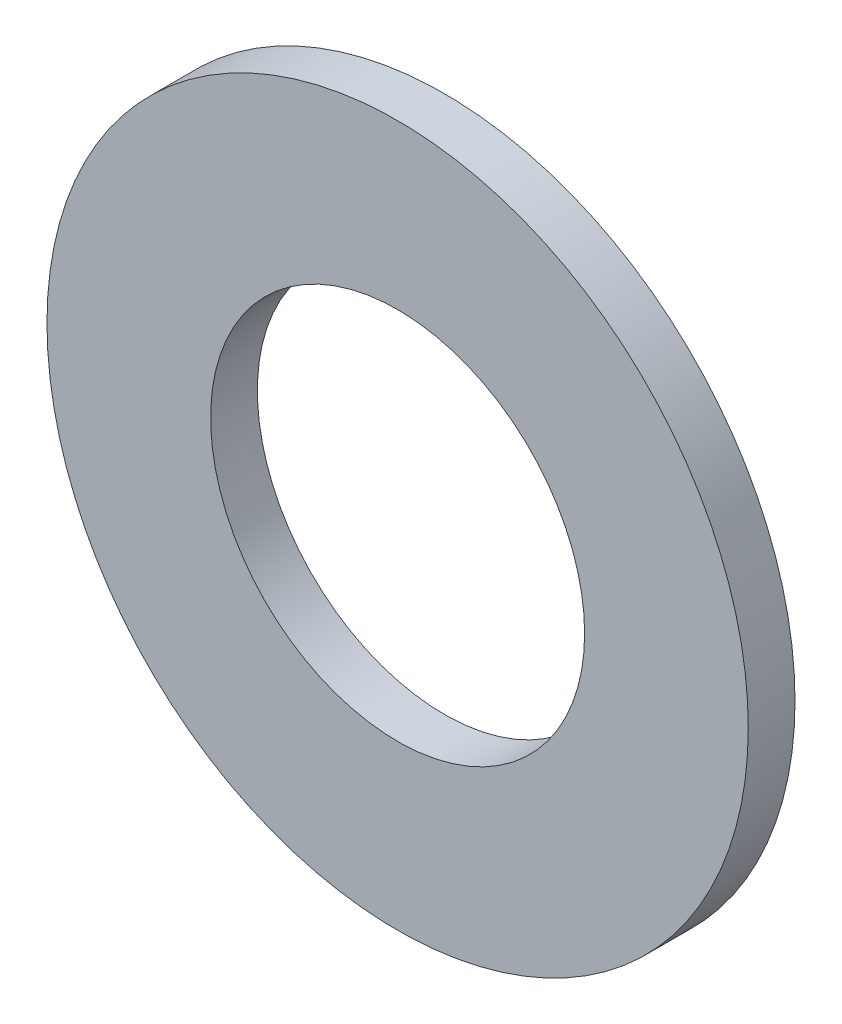
ISO-10303-21;
HEADER;
FILE_DESCRIPTION(('STEP AP214'),'2;1');
FILE_NAME('part.step','',(''),(''),'','','');
FILE_SCHEMA(('AUTOMOTIVE_DESIGN { 1 0 10303 214 1 1 1 1 }'));
ENDSEC;
DATA;
#1=APPLICATION_CONTEXT('core data for automotive mechanical design processes');
#2=APPLICATION_PROTOCOL_DEFINITION('international standard','automotive_design',2000,#1);
#3=PRODUCT_CONTEXT('',#1,'mechanical');
#4=PRODUCT('Part','Part','',(#3));
#5=PRODUCT_RELATED_PRODUCT_CATEGORY('part','',(#4));
#6=PRODUCT_DEFINITION_FORMATION('','',#4);
#7=PRODUCT_DEFINITION_CONTEXT('part definition',#1,'design');
#8=PRODUCT_DEFINITION('design','',#6,#7);
#9=PRODUCT_DEFINITION_SHAPE('','',#8);
#10=(LENGTH_UNIT() NAMED_UNIT(*) SI_UNIT(.MILLI.,.METRE.));
#11=(NAMED_UNIT(*) PLANE_ANGLE_UNIT() SI_UNIT($,.RADIAN.));
#12=(NAMED_UNIT(*) SI_UNIT($,.STERADIAN.) SOLID_ANGLE_UNIT());
#13=UNCERTAINTY_MEASURE_WITH_UNIT(LENGTH_MEASURE(1.E-05),#10,'distance_accuracy_value','');
#14=(GEOMETRIC_REPRESENTATION_CONTEXT(3) GLOBAL_UNCERTAINTY_ASSIGNED_CONTEXT((#13)) GLOBAL_UNIT_ASSIGNED_CONTEXT((#10,
#11,#12)) REPRESENTATION_CONTEXT('',''));
#15=CARTESIAN_POINT('',(0.,0.,0.));
#16=DIRECTION('',(0.,0.,1.));
#17=DIRECTION('',(1.,0.,0.));
#18=AXIS2_PLACEMENT_3D('',#15,#16,#17);
#19=CARTESIAN_POINT('',(-17.2663756181561,15.576677852349,1.));
#20=DIRECTION('',(0.,0.,1.));
#21=DIRECTION('',(1.,0.,0.));
#22=AXIS2_PLACEMENT_3D('',#19,#20,#21);
#23=PLANE('',#22);
#24=CARTESIAN_POINT('',(-17.2663756181561,15.576677852349,1.));
#25=DIRECTION('',(0.,0.,1.));
#26=DIRECTION('',(1.,0.,0.));
#27=AXIS2_PLACEMENT_3D('',#24,#25,#26);
#28=CIRCLE('',#27,7.5);
#29=CARTESIAN_POINT('',(-9.76637561815614,15.576677852349,1.));
#30=VERTEX_POINT('',#29);
#31=EDGE_CURVE('E10',#30,#30,#28,.T.);
#32=ORIENTED_EDGE('',*,*,#31,.T.);
#33=EDGE_LOOP('',(#32));
#34=FACE_BOUND('',#33,.T.);
#35=CARTESIAN_POINT('',(-17.2663756181561,15.576677852349,1.));
#36=DIRECTION('',(0.,0.,1.));
#37=DIRECTION('',(1.,0.,0.));
#38=AXIS2_PLACEMENT_3D('',#35,#36,#37);
#39=CIRCLE('',#38,4.);
#40=CARTESIAN_POINT('',(-13.2663756181561,15.576677852349,1.));
#41=VERTEX_POINT('',#40);
#42=EDGE_CURVE('E42',#41,#41,#39,.T.);
#43=ORIENTED_EDGE('',*,*,#42,.F.);
#44=EDGE_LOOP('',(#43));
#45=FACE_BOUND('',#44,.T.);
#46=ADVANCED_FACE('F31',(#34,#45),#23,.T.);
#47=CARTESIAN_POINT('',(-17.2663756181561,15.576677852349,0.));
#48=DIRECTION('',(0.,0.,1.));
#49=DIRECTION('',(1.,0.,0.));
#50=AXIS2_PLACEMENT_3D('',#47,#48,#49);
#51=PLANE('',#50);
#52=CARTESIAN_POINT('',(-17.2663756181561,15.576677852349,0.));
#53=DIRECTION('',(0.,0.,1.));
#54=DIRECTION('',(1.,0.,0.));
#55=AXIS2_PLACEMENT_3D('',#52,#53,#54);
#56=CIRCLE('',#55,7.5);
#57=CARTESIAN_POINT('',(-9.76637561815614,15.576677852349,0.));
#58=VERTEX_POINT('',#57);
#59=EDGE_CURVE('E35',#58,#58,#56,.T.);
#60=ORIENTED_EDGE('',*,*,#59,.F.);
#61=EDGE_LOOP('',(#60));
#62=FACE_BOUND('',#61,.T.);
#63=CARTESIAN_POINT('',(-17.2663756181561,15.576677852349,0.));
#64=DIRECTION('',(0.,0.,1.));
#65=DIRECTION('',(1.,0.,0.));
#66=AXIS2_PLACEMENT_3D('',#63,#64,#65);
#67=CIRCLE('',#66,4.);
#68=CARTESIAN_POINT('',(-13.2663756181561,15.576677852349,0.));
#69=VERTEX_POINT('',#68);
#70=EDGE_CURVE('E44',#69,#69,#67,.T.);
#71=ORIENTED_EDGE('',*,*,#70,.T.);
#72=EDGE_LOOP('',(#71));
#73=FACE_BOUND('',#72,.T.);
#74=ADVANCED_FACE('F54',(#62,#73),#51,.F.);
#75=CARTESIAN_POINT('',(-17.2663756181561,15.576677852349,1.));
#76=DIRECTION('',(0.,0.,-1.));
#77=DIRECTION('',(-1.,0.,0.));
#78=AXIS2_PLACEMENT_3D('',#75,#76,#77);
#79=CYLINDRICAL_SURFACE('',#78,7.5);
#80=ORIENTED_EDGE('',*,*,#31,.F.);
#81=EDGE_LOOP('',(#80));
#82=FACE_BOUND('',#81,.T.);
#83=ORIENTED_EDGE('',*,*,#59,.T.);
#84=EDGE_LOOP('',(#83));
#85=FACE_BOUND('',#84,.T.);
#86=ADVANCED_FACE('F33',(#82,#85),#79,.T.);
#87=CARTESIAN_POINT('',(-17.2663756181561,15.576677852349,1.));
#88=DIRECTION('',(0.,0.,-1.));
#89=DIRECTION('',(-1.,0.,0.));
#90=AXIS2_PLACEMENT_3D('',#87,#88,#89);
#91=CYLINDRICAL_SURFACE('',#90,4.);
#92=ORIENTED_EDGE('',*,*,#42,.T.);
#93=EDGE_LOOP('',(#92));
#94=FACE_BOUND('',#93,.T.);
#95=ORIENTED_EDGE('',*,*,#70,.F.);
#96=EDGE_LOOP('',(#95));
#97=FACE_BOUND('',#96,.T.);
#98=ADVANCED_FACE('F50',(#94,#97),#91,.F.);
#99=CLOSED_SHELL('',(#46,#74,#86,#98));
#100=MANIFOLD_SOLID_BREP('B2',#99);
#101=ADVANCED_BREP_SHAPE_REPRESENTATION('',(#18,#100),#14);
#102=SHAPE_DEFINITION_REPRESENTATION(#9,#101);
ENDSEC;
END-ISO-10303-21;
